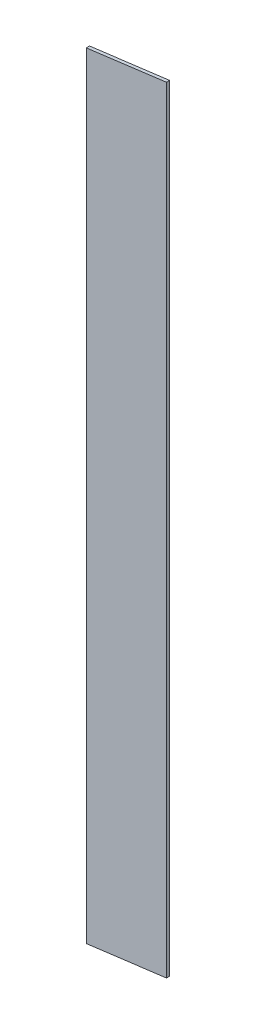
ISO-10303-21;
HEADER;
FILE_DESCRIPTION(('STEP AP214'),'2;1');
FILE_NAME('part.step','',(''),(''),'','','');
FILE_SCHEMA(('AUTOMOTIVE_DESIGN { 1 0 10303 214 1 1 1 1 }'));
ENDSEC;
DATA;
#1=APPLICATION_CONTEXT('core data for automotive mechanical design processes');
#2=APPLICATION_PROTOCOL_DEFINITION('international standard','automotive_design',2000,#1);
#3=PRODUCT_CONTEXT('',#1,'mechanical');
#4=PRODUCT('Part','Part','',(#3));
#5=PRODUCT_RELATED_PRODUCT_CATEGORY('part','',(#4));
#6=PRODUCT_DEFINITION_FORMATION('','',#4);
#7=PRODUCT_DEFINITION_CONTEXT('part definition',#1,'design');
#8=PRODUCT_DEFINITION('design','',#6,#7);
#9=PRODUCT_DEFINITION_SHAPE('','',#8);
#10=(LENGTH_UNIT() NAMED_UNIT(*) SI_UNIT(.MILLI.,.METRE.));
#11=(NAMED_UNIT(*) PLANE_ANGLE_UNIT() SI_UNIT($,.RADIAN.));
#12=(NAMED_UNIT(*) SI_UNIT($,.STERADIAN.) SOLID_ANGLE_UNIT());
#13=UNCERTAINTY_MEASURE_WITH_UNIT(LENGTH_MEASURE(1.E-05),#10,'distance_accuracy_value','');
#14=(GEOMETRIC_REPRESENTATION_CONTEXT(3) GLOBAL_UNCERTAINTY_ASSIGNED_CONTEXT((#13)) GLOBAL_UNIT_ASSIGNED_CONTEXT((#10,
#11,#12)) REPRESENTATION_CONTEXT('',''));
#15=CARTESIAN_POINT('',(0.,0.,0.));
#16=DIRECTION('',(0.,0.,1.));
#17=DIRECTION('',(1.,0.,0.));
#18=AXIS2_PLACEMENT_3D('',#15,#16,#17);
#19=CARTESIAN_POINT('',(25.,325.,1.));
#20=DIRECTION('',(-1.,0.,0.));
#21=DIRECTION('',(0.,-1.,0.));
#22=AXIS2_PLACEMENT_3D('',#19,#20,#21);
#23=PLANE('',#22);
#24=DIRECTION('',(0.,0.,1.));
#25=VECTOR('',#24,1.);
#26=CARTESIAN_POINT('',(25.,-235.549361567875,1.));
#27=LINE('',#26,#25);
#28=CARTESIAN_POINT('',(25.,-235.549361567875,-1.));
#29=VERTEX_POINT('',#28);
#30=CARTESIAN_POINT('',(25.,-235.549361567875,1.));
#31=VERTEX_POINT('',#30);
#32=EDGE_CURVE('E76',#29,#31,#27,.T.);
#33=ORIENTED_EDGE('',*,*,#32,.F.);
#34=DIRECTION('',(0.,1.,0.));
#35=VECTOR('',#34,1.);
#36=CARTESIAN_POINT('',(25.,325.,-1.));
#37=LINE('',#36,#35);
#38=CARTESIAN_POINT('',(25.,248.394189154082,-1.));
#39=VERTEX_POINT('',#38);
#40=EDGE_CURVE('E100',#29,#39,#37,.T.);
#41=ORIENTED_EDGE('',*,*,#40,.T.);
#42=DIRECTION('',(0.,0.,-1.));
#43=VECTOR('',#42,1.);
#44=CARTESIAN_POINT('',(25.,248.394189154082,1.));
#45=LINE('',#44,#43);
#46=CARTESIAN_POINT('',(24.9999999999999,248.394189154082,1.));
#47=VERTEX_POINT('',#46);
#48=EDGE_CURVE('E57',#47,#39,#45,.T.);
#49=ORIENTED_EDGE('',*,*,#48,.F.);
#50=DIRECTION('',(0.,1.,0.));
#51=VECTOR('',#50,1.);
#52=CARTESIAN_POINT('',(25.,325.,1.));
#53=LINE('',#52,#51);
#54=EDGE_CURVE('E95',#31,#47,#53,.T.);
#55=ORIENTED_EDGE('',*,*,#54,.F.);
#56=EDGE_LOOP('',(#33,#41,#49,#55));
#57=FACE_BOUND('',#56,.T.);
#58=ADVANCED_FACE('F36',(#57),#23,.F.);
#59=CARTESIAN_POINT('',(-25.,325.,1.));
#60=DIRECTION('',(1.,0.,0.));
#61=DIRECTION('',(0.,1.,0.));
#62=AXIS2_PLACEMENT_3D('',#59,#60,#61);
#63=PLANE('',#62);
#64=DIRECTION('',(0.,0.,-1.));
#65=VECTOR('',#64,1.);
#66=CARTESIAN_POINT('',(-24.9999999999999,-241.971775360978,1.));
#67=LINE('',#66,#65);
#68=CARTESIAN_POINT('',(-24.9999999999999,-241.971775360978,1.));
#69=VERTEX_POINT('',#68);
#70=CARTESIAN_POINT('',(-25.,-241.971775360978,-1.));
#71=VERTEX_POINT('',#70);
#72=EDGE_CURVE('E49',#69,#71,#67,.T.);
#73=ORIENTED_EDGE('',*,*,#72,.F.);
#74=DIRECTION('',(0.,-1.,0.));
#75=VECTOR('',#74,1.);
#76=CARTESIAN_POINT('',(-25.,325.,1.));
#77=LINE('',#76,#75);
#78=CARTESIAN_POINT('',(-25.0000000000002,241.971775360978,1.));
#79=VERTEX_POINT('',#78);
#80=EDGE_CURVE('E43',#79,#69,#77,.T.);
#81=ORIENTED_EDGE('',*,*,#80,.F.);
#82=DIRECTION('',(0.,0.,-1.));
#83=VECTOR('',#82,1.);
#84=CARTESIAN_POINT('',(-25.0000000000001,241.971775360978,1.));
#85=LINE('',#84,#83);
#86=CARTESIAN_POINT('',(-25.0000000000001,241.971775360978,-1.));
#87=VERTEX_POINT('',#86);
#88=EDGE_CURVE('E91',#79,#87,#85,.T.);
#89=ORIENTED_EDGE('',*,*,#88,.T.);
#90=DIRECTION('',(0.,-1.,0.));
#91=VECTOR('',#90,1.);
#92=CARTESIAN_POINT('',(-25.,325.,-1.));
#93=LINE('',#92,#91);
#94=EDGE_CURVE('E90',#87,#71,#93,.T.);
#95=ORIENTED_EDGE('',*,*,#94,.T.);
#96=EDGE_LOOP('',(#73,#81,#89,#95));
#97=FACE_BOUND('',#96,.T.);
#98=ADVANCED_FACE('F87',(#97),#63,.F.);
#99=CARTESIAN_POINT('',(0.,0.,1.));
#100=DIRECTION('',(0.,0.,1.));
#101=DIRECTION('',(1.,0.,0.));
#102=AXIS2_PLACEMENT_3D('',#99,#100,#101);
#103=PLANE('',#102);
#104=ORIENTED_EDGE('',*,*,#80,.T.);
#105=DIRECTION('',(-0.991851217531315,-0.127401578803592,0.));
#106=VECTOR('',#105,1.);
#107=CARTESIAN_POINT('',(-24.9999999999999,-241.971775360978,1.));
#108=LINE('',#107,#106);
#109=EDGE_CURVE('E73',#31,#69,#108,.T.);
#110=ORIENTED_EDGE('',*,*,#109,.F.);
#111=ORIENTED_EDGE('',*,*,#54,.T.);
#112=DIRECTION('',(0.991851217531315,0.127401578803592,0.));
#113=VECTOR('',#112,1.);
#114=CARTESIAN_POINT('',(2061.70105373834,510.004927953232,1.));
#115=LINE('',#114,#113);
#116=EDGE_CURVE('E81',#79,#47,#115,.T.);
#117=ORIENTED_EDGE('',*,*,#116,.F.);
#118=EDGE_LOOP('',(#104,#110,#111,#117));
#119=FACE_BOUND('',#118,.T.);
#120=ADVANCED_FACE('F94',(#119),#103,.T.);
#121=CARTESIAN_POINT('',(0.,0.,-1.));
#122=DIRECTION('',(0.,0.,1.));
#123=DIRECTION('',(1.,0.,0.));
#124=AXIS2_PLACEMENT_3D('',#121,#122,#123);
#125=PLANE('',#124);
#126=DIRECTION('',(0.991851217531315,0.127401578803592,0.));
#127=VECTOR('',#126,1.);
#128=CARTESIAN_POINT('',(30.1705998558209,-234.885206931222,-1.));
#129=LINE('',#128,#127);
#130=EDGE_CURVE('E12',#71,#29,#129,.T.);
#131=ORIENTED_EDGE('',*,*,#130,.F.);
#132=ORIENTED_EDGE('',*,*,#94,.F.);
#133=DIRECTION('',(0.991851217531315,0.127401578803592,0.));
#134=VECTOR('',#133,1.);
#135=CARTESIAN_POINT('',(2061.70105373834,510.004927953232,-1.));
#136=LINE('',#135,#134);
#137=EDGE_CURVE('E82',#87,#39,#136,.T.);
#138=ORIENTED_EDGE('',*,*,#137,.T.);
#139=ORIENTED_EDGE('',*,*,#40,.F.);
#140=EDGE_LOOP('',(#131,#132,#138,#139));
#141=FACE_BOUND('',#140,.T.);
#142=ADVANCED_FACE('F110',(#141),#125,.F.);
#143=CARTESIAN_POINT('',(2061.70105373834,510.004927953232,1.));
#144=DIRECTION('',(-0.127401578803592,0.991851217531315,0.));
#145=DIRECTION('',(-0.991851217531315,-0.127401578803592,0.));
#146=AXIS2_PLACEMENT_3D('',#143,#144,#145);
#147=PLANE('',#146);
#148=ORIENTED_EDGE('',*,*,#48,.T.);
#149=ORIENTED_EDGE('',*,*,#137,.F.);
#150=ORIENTED_EDGE('',*,*,#88,.F.);
#151=ORIENTED_EDGE('',*,*,#116,.T.);
#152=EDGE_LOOP('',(#148,#149,#150,#151));
#153=FACE_BOUND('',#152,.T.);
#154=ADVANCED_FACE('F108',(#153),#147,.T.);
#155=CARTESIAN_POINT('',(-24.9999999999999,-241.971775360978,1.));
#156=DIRECTION('',(0.127401578803592,-0.991851217531315,0.));
#157=DIRECTION('',(0.991851217531315,0.127401578803592,0.));
#158=AXIS2_PLACEMENT_3D('',#155,#156,#157);
#159=PLANE('',#158);
#160=ORIENTED_EDGE('',*,*,#32,.T.);
#161=ORIENTED_EDGE('',*,*,#109,.T.);
#162=ORIENTED_EDGE('',*,*,#72,.T.);
#163=ORIENTED_EDGE('',*,*,#130,.T.);
#164=EDGE_LOOP('',(#160,#161,#162,#163));
#165=FACE_BOUND('',#164,.T.);
#166=ADVANCED_FACE('F74',(#165),#159,.T.);
#167=CLOSED_SHELL('',(#58,#98,#120,#142,#154,#166));
#168=MANIFOLD_SOLID_BREP('B2',#167);
#169=ADVANCED_BREP_SHAPE_REPRESENTATION('',(#18,#168),#14);
#170=SHAPE_DEFINITION_REPRESENTATION(#9,#169);
ENDSEC;
END-ISO-10303-21;
